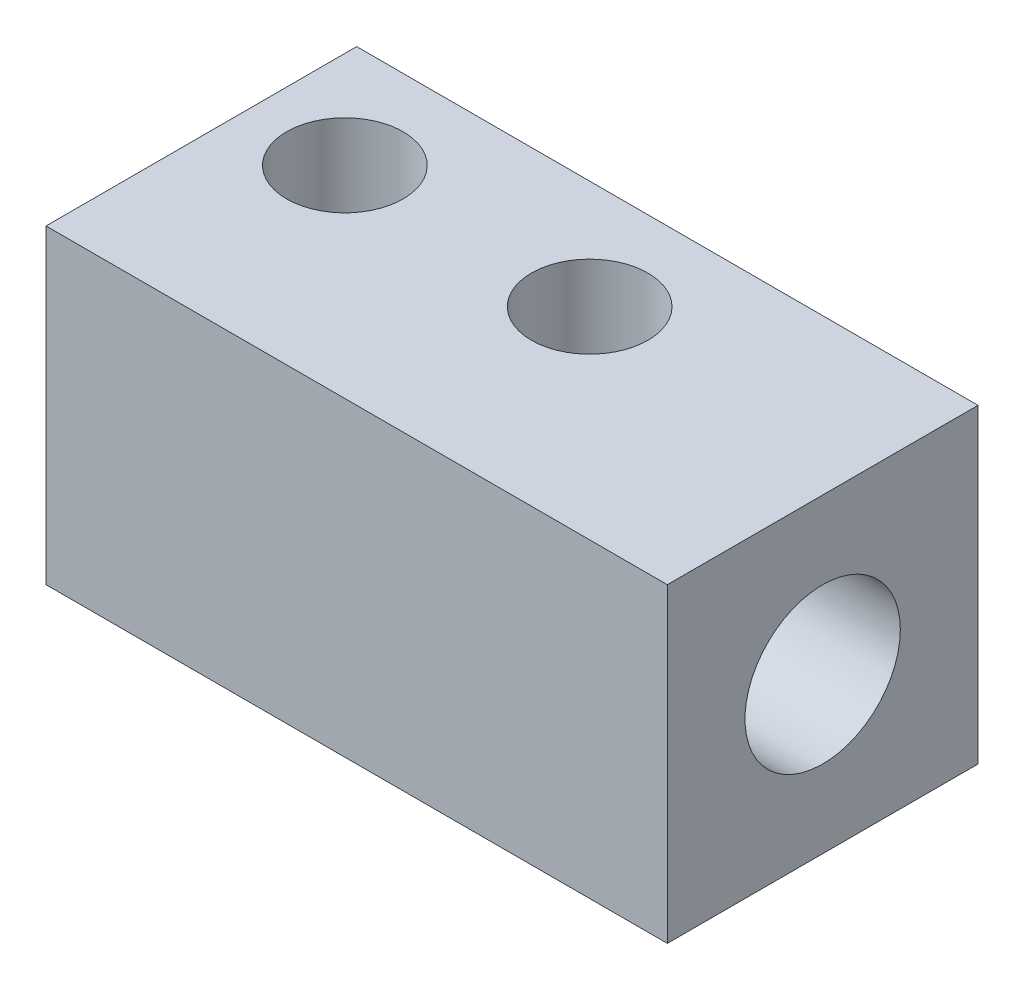
ISO-10303-21;
HEADER;
FILE_DESCRIPTION(('STEP AP214'),'2;1');
FILE_NAME('part.step','',(''),(''),'','','');
FILE_SCHEMA(('AUTOMOTIVE_DESIGN { 1 0 10303 214 1 1 1 1 }'));
ENDSEC;
DATA;
#1=APPLICATION_CONTEXT('core data for automotive mechanical design processes');
#2=APPLICATION_PROTOCOL_DEFINITION('international standard','automotive_design',2000,#1);
#3=PRODUCT_CONTEXT('',#1,'mechanical');
#4=PRODUCT('Part','Part','',(#3));
#5=PRODUCT_RELATED_PRODUCT_CATEGORY('part','',(#4));
#6=PRODUCT_DEFINITION_FORMATION('','',#4);
#7=PRODUCT_DEFINITION_CONTEXT('part definition',#1,'design');
#8=PRODUCT_DEFINITION('design','',#6,#7);
#9=PRODUCT_DEFINITION_SHAPE('','',#8);
#10=(LENGTH_UNIT() NAMED_UNIT(*) SI_UNIT(.MILLI.,.METRE.));
#11=(NAMED_UNIT(*) PLANE_ANGLE_UNIT() SI_UNIT($,.RADIAN.));
#12=(NAMED_UNIT(*) SI_UNIT($,.STERADIAN.) SOLID_ANGLE_UNIT());
#13=UNCERTAINTY_MEASURE_WITH_UNIT(LENGTH_MEASURE(1.E-05),#10,'distance_accuracy_value','');
#14=(GEOMETRIC_REPRESENTATION_CONTEXT(3) GLOBAL_UNCERTAINTY_ASSIGNED_CONTEXT((#13)) GLOBAL_UNIT_ASSIGNED_CONTEXT((#10,
#11,#12)) REPRESENTATION_CONTEXT('',''));
#15=CARTESIAN_POINT('',(0.,0.,0.));
#16=DIRECTION('',(0.,0.,1.));
#17=DIRECTION('',(1.,0.,0.));
#18=AXIS2_PLACEMENT_3D('',#15,#16,#17);
#19=CARTESIAN_POINT('',(0.,0.,6.34999999999999));
#20=DIRECTION('',(1.,0.,0.));
#21=DIRECTION('',(0.,0.,-1.));
#22=AXIS2_PLACEMENT_3D('',#19,#20,#21);
#23=PLANE('',#22);
#24=DIRECTION('',(0.,-1.,0.));
#25=VECTOR('',#24,1.);
#26=CARTESIAN_POINT('',(0.,0.,-6.34999999999999));
#27=LINE('',#26,#25);
#28=CARTESIAN_POINT('',(-1.11022302462516E-13,12.7,-6.34999999999999));
#29=VERTEX_POINT('',#28);
#30=CARTESIAN_POINT('',(0.,0.,-6.34999999999999));
#31=VERTEX_POINT('',#30);
#32=EDGE_CURVE('E105',#29,#31,#27,.T.);
#33=ORIENTED_EDGE('',*,*,#32,.T.);
#34=DIRECTION('',(0.,0.,-1.));
#35=VECTOR('',#34,1.);
#36=CARTESIAN_POINT('',(0.,0.,6.34999999999999));
#37=LINE('',#36,#35);
#38=CARTESIAN_POINT('',(0.,0.,6.34999999999999));
#39=VERTEX_POINT('',#38);
#40=EDGE_CURVE('E11',#39,#31,#37,.T.);
#41=ORIENTED_EDGE('',*,*,#40,.F.);
#42=DIRECTION('',(0.,-1.,0.));
#43=VECTOR('',#42,1.);
#44=CARTESIAN_POINT('',(0.,0.,6.34999999999999));
#45=LINE('',#44,#43);
#46=CARTESIAN_POINT('',(0.,12.7,6.35));
#47=VERTEX_POINT('',#46);
#48=EDGE_CURVE('E93',#47,#39,#45,.T.);
#49=ORIENTED_EDGE('',*,*,#48,.F.);
#50=DIRECTION('',(0.,0.,-1.));
#51=VECTOR('',#50,1.);
#52=CARTESIAN_POINT('',(0.,12.7,6.35));
#53=LINE('',#52,#51);
#54=EDGE_CURVE('E101',#47,#29,#53,.T.);
#55=ORIENTED_EDGE('',*,*,#54,.T.);
#56=EDGE_LOOP('',(#33,#41,#49,#55));
#57=FACE_BOUND('',#56,.T.);
#58=ADVANCED_FACE('F42',(#57),#23,.F.);
#59=CARTESIAN_POINT('',(0.,0.,6.34999999999999));
#60=DIRECTION('',(0.,1.,0.));
#61=DIRECTION('',(0.,0.,1.));
#62=AXIS2_PLACEMENT_3D('',#59,#60,#61);
#63=PLANE('',#62);
#64=CARTESIAN_POINT('',(13.97,0.,-1.905));
#65=DIRECTION('',(0.,1.,0.));
#66=DIRECTION('',(0.,0.,1.));
#67=AXIS2_PLACEMENT_3D('',#64,#65,#66);
#68=CIRCLE('',#67,2.38125);
#69=CARTESIAN_POINT('',(13.97,0.,0.476249999999993));
#70=VERTEX_POINT('',#69);
#71=EDGE_CURVE('E124',#70,#70,#68,.T.);
#72=ORIENTED_EDGE('',*,*,#71,.T.);
#73=EDGE_LOOP('',(#72));
#74=FACE_BOUND('',#73,.T.);
#75=CARTESIAN_POINT('',(3.96240000000001,0.,-1.90500000000003));
#76=DIRECTION('',(0.,1.,0.));
#77=DIRECTION('',(0.,0.,1.));
#78=AXIS2_PLACEMENT_3D('',#75,#76,#77);
#79=CIRCLE('',#78,2.38125);
#80=CARTESIAN_POINT('',(3.96240000000001,0.,0.476249999999964));
#81=VERTEX_POINT('',#80);
#82=EDGE_CURVE('E108',#81,#81,#79,.T.);
#83=ORIENTED_EDGE('',*,*,#82,.T.);
#84=EDGE_LOOP('',(#83));
#85=FACE_BOUND('',#84,.T.);
#86=DIRECTION('',(1.,0.,0.));
#87=VECTOR('',#86,1.);
#88=CARTESIAN_POINT('',(0.,0.,-6.34999999999999));
#89=LINE('',#88,#87);
#90=CARTESIAN_POINT('',(25.4,0.,-6.35000000000002));
#91=VERTEX_POINT('',#90);
#92=EDGE_CURVE('E97',#31,#91,#89,.T.);
#93=ORIENTED_EDGE('',*,*,#92,.T.);
#94=DIRECTION('',(0.,0.,-1.));
#95=VECTOR('',#94,1.);
#96=CARTESIAN_POINT('',(25.4,0.,6.34999999999998));
#97=LINE('',#96,#95);
#98=CARTESIAN_POINT('',(25.4,0.,6.34999999999998));
#99=VERTEX_POINT('',#98);
#100=EDGE_CURVE('E50',#99,#91,#97,.T.);
#101=ORIENTED_EDGE('',*,*,#100,.F.);
#102=DIRECTION('',(1.,0.,0.));
#103=VECTOR('',#102,1.);
#104=CARTESIAN_POINT('',(0.,0.,6.34999999999999));
#105=LINE('',#104,#103);
#106=EDGE_CURVE('E88',#39,#99,#105,.T.);
#107=ORIENTED_EDGE('',*,*,#106,.F.);
#108=ORIENTED_EDGE('',*,*,#40,.T.);
#109=EDGE_LOOP('',(#93,#101,#107,#108));
#110=FACE_BOUND('',#109,.T.);
#111=ADVANCED_FACE('F96',(#74,#85,#110),#63,.F.);
#112=CARTESIAN_POINT('',(25.4,0.,6.34999999999998));
#113=DIRECTION('',(-1.,0.,0.));
#114=DIRECTION('',(0.,0.,1.));
#115=AXIS2_PLACEMENT_3D('',#112,#113,#114);
#116=PLANE('',#115);
#117=CARTESIAN_POINT('',(25.4,6.35000000000003,0.));
#118=DIRECTION('',(1.,0.,0.));
#119=DIRECTION('',(0.,0.,-1.));
#120=AXIS2_PLACEMENT_3D('',#117,#118,#119);
#121=CIRCLE('',#120,3.175);
#122=CARTESIAN_POINT('',(25.4,6.35000000000002,-3.17500000000002));
#123=VERTEX_POINT('',#122);
#124=EDGE_CURVE('E131',#123,#123,#121,.T.);
#125=ORIENTED_EDGE('',*,*,#124,.F.);
#126=EDGE_LOOP('',(#125));
#127=FACE_BOUND('',#126,.T.);
#128=DIRECTION('',(0.,1.,0.));
#129=VECTOR('',#128,1.);
#130=CARTESIAN_POINT('',(25.4,0.,-6.35000000000002));
#131=LINE('',#130,#129);
#132=CARTESIAN_POINT('',(25.4,12.7,-6.34999999999997));
#133=VERTEX_POINT('',#132);
#134=EDGE_CURVE('E75',#91,#133,#131,.T.);
#135=ORIENTED_EDGE('',*,*,#134,.T.);
#136=DIRECTION('',(0.,0.,-1.));
#137=VECTOR('',#136,1.);
#138=CARTESIAN_POINT('',(25.4,12.7,6.35));
#139=LINE('',#138,#137);
#140=CARTESIAN_POINT('',(25.4,12.7,6.35));
#141=VERTEX_POINT('',#140);
#142=EDGE_CURVE('E98',#141,#133,#139,.T.);
#143=ORIENTED_EDGE('',*,*,#142,.F.);
#144=DIRECTION('',(0.,1.,0.));
#145=VECTOR('',#144,1.);
#146=CARTESIAN_POINT('',(25.4,0.,6.34999999999998));
#147=LINE('',#146,#145);
#148=EDGE_CURVE('E91',#99,#141,#147,.T.);
#149=ORIENTED_EDGE('',*,*,#148,.F.);
#150=ORIENTED_EDGE('',*,*,#100,.T.);
#151=EDGE_LOOP('',(#135,#143,#149,#150));
#152=FACE_BOUND('',#151,.T.);
#153=ADVANCED_FACE('F99',(#127,#152),#116,.F.);
#154=CARTESIAN_POINT('',(0.,12.7,6.35));
#155=DIRECTION('',(0.,-1.,0.));
#156=DIRECTION('',(0.,0.,-1.));
#157=AXIS2_PLACEMENT_3D('',#154,#155,#156);
#158=PLANE('',#157);
#159=CARTESIAN_POINT('',(13.97,12.7,-1.90499999999998));
#160=DIRECTION('',(0.,1.,0.));
#161=DIRECTION('',(0.,0.,1.));
#162=AXIS2_PLACEMENT_3D('',#159,#160,#161);
#163=CIRCLE('',#162,2.38125);
#164=CARTESIAN_POINT('',(13.97,12.7,0.476250000000014));
#165=VERTEX_POINT('',#164);
#166=EDGE_CURVE('E127',#165,#165,#163,.T.);
#167=ORIENTED_EDGE('',*,*,#166,.F.);
#168=EDGE_LOOP('',(#167));
#169=FACE_BOUND('',#168,.T.);
#170=CARTESIAN_POINT('',(3.96239999999989,12.7,-1.90500000000001));
#171=DIRECTION('',(0.,1.,0.));
#172=DIRECTION('',(0.,0.,1.));
#173=AXIS2_PLACEMENT_3D('',#170,#171,#172);
#174=CIRCLE('',#173,2.38125);
#175=CARTESIAN_POINT('',(3.96239999999989,12.7,0.476249999999986));
#176=VERTEX_POINT('',#175);
#177=EDGE_CURVE('E121',#176,#176,#174,.T.);
#178=ORIENTED_EDGE('',*,*,#177,.F.);
#179=EDGE_LOOP('',(#178));
#180=FACE_BOUND('',#179,.T.);
#181=DIRECTION('',(-1.,0.,0.));
#182=VECTOR('',#181,1.);
#183=CARTESIAN_POINT('',(-1.11022302462516E-13,12.7,-6.34999999999999));
#184=LINE('',#183,#182);
#185=EDGE_CURVE('E81',#133,#29,#184,.T.);
#186=ORIENTED_EDGE('',*,*,#185,.T.);
#187=ORIENTED_EDGE('',*,*,#54,.F.);
#188=DIRECTION('',(-1.,0.,0.));
#189=VECTOR('',#188,1.);
#190=CARTESIAN_POINT('',(0.,12.7,6.35));
#191=LINE('',#190,#189);
#192=EDGE_CURVE('E58',#141,#47,#191,.T.);
#193=ORIENTED_EDGE('',*,*,#192,.F.);
#194=ORIENTED_EDGE('',*,*,#142,.T.);
#195=EDGE_LOOP('',(#186,#187,#193,#194));
#196=FACE_BOUND('',#195,.T.);
#197=ADVANCED_FACE('F113',(#169,#180,#196),#158,.F.);
#198=CARTESIAN_POINT('',(0.,0.,6.34999999999999));
#199=DIRECTION('',(0.,0.,-1.));
#200=DIRECTION('',(-1.,0.,0.));
#201=AXIS2_PLACEMENT_3D('',#198,#199,#200);
#202=PLANE('',#201);
#203=ORIENTED_EDGE('',*,*,#48,.T.);
#204=ORIENTED_EDGE('',*,*,#106,.T.);
#205=ORIENTED_EDGE('',*,*,#148,.T.);
#206=ORIENTED_EDGE('',*,*,#192,.T.);
#207=EDGE_LOOP('',(#203,#204,#205,#206));
#208=FACE_BOUND('',#207,.T.);
#209=ADVANCED_FACE('F89',(#208),#202,.F.);
#210=CARTESIAN_POINT('',(0.,0.,-6.34999999999999));
#211=DIRECTION('',(0.,0.,-1.));
#212=DIRECTION('',(-1.,0.,0.));
#213=AXIS2_PLACEMENT_3D('',#210,#211,#212);
#214=PLANE('',#213);
#215=ORIENTED_EDGE('',*,*,#32,.F.);
#216=ORIENTED_EDGE('',*,*,#185,.F.);
#217=ORIENTED_EDGE('',*,*,#134,.F.);
#218=ORIENTED_EDGE('',*,*,#92,.F.);
#219=EDGE_LOOP('',(#215,#216,#217,#218));
#220=FACE_BOUND('',#219,.T.);
#221=ADVANCED_FACE('F116',(#220),#214,.T.);
#222=CARTESIAN_POINT('',(3.96239999999989,12.7,-1.90500000000001));
#223=DIRECTION('',(0.,1.,0.));
#224=DIRECTION('',(0.,0.,1.));
#225=AXIS2_PLACEMENT_3D('',#222,#223,#224);
#226=CYLINDRICAL_SURFACE('',#225,2.38125);
#227=ORIENTED_EDGE('',*,*,#82,.F.);
#228=EDGE_LOOP('',(#227));
#229=FACE_BOUND('',#228,.T.);
#230=ORIENTED_EDGE('',*,*,#177,.T.);
#231=EDGE_LOOP('',(#230));
#232=FACE_BOUND('',#231,.T.);
#233=ADVANCED_FACE('F189',(#229,#232),#226,.F.);
#234=CARTESIAN_POINT('',(13.97,12.7,-1.90499999999998));
#235=DIRECTION('',(0.,1.,0.));
#236=DIRECTION('',(0.,0.,1.));
#237=AXIS2_PLACEMENT_3D('',#234,#235,#236);
#238=CYLINDRICAL_SURFACE('',#237,2.38125);
#239=ORIENTED_EDGE('',*,*,#71,.F.);
#240=EDGE_LOOP('',(#239));
#241=FACE_BOUND('',#240,.T.);
#242=ORIENTED_EDGE('',*,*,#166,.T.);
#243=EDGE_LOOP('',(#242));
#244=FACE_BOUND('',#243,.T.);
#245=ADVANCED_FACE('F142',(#241,#244),#238,.F.);
#246=CARTESIAN_POINT('',(19.05,6.34999999999997,0.));
#247=DIRECTION('',(1.,0.,0.));
#248=DIRECTION('',(0.,0.,-1.));
#249=AXIS2_PLACEMENT_3D('',#246,#247,#248);
#250=CYLINDRICAL_SURFACE('',#249,3.175);
#251=CARTESIAN_POINT('',(19.05,6.34999999999997,0.));
#252=DIRECTION('',(1.,0.,0.));
#253=DIRECTION('',(0.,0.,-1.));
#254=AXIS2_PLACEMENT_3D('',#251,#252,#253);
#255=CIRCLE('',#254,3.175);
#256=CARTESIAN_POINT('',(19.05,6.34999999999997,-3.17500000000002));
#257=VERTEX_POINT('',#256);
#258=EDGE_CURVE('E130',#257,#257,#255,.T.);
#259=ORIENTED_EDGE('',*,*,#258,.F.);
#260=EDGE_LOOP('',(#259));
#261=FACE_BOUND('',#260,.T.);
#262=ORIENTED_EDGE('',*,*,#124,.T.);
#263=EDGE_LOOP('',(#262));
#264=FACE_BOUND('',#263,.T.);
#265=ADVANCED_FACE('F139',(#261,#264),#250,.F.);
#266=CARTESIAN_POINT('',(19.05,6.34999999999997,0.));
#267=DIRECTION('',(1.,0.,0.));
#268=DIRECTION('',(0.,0.,-1.));
#269=AXIS2_PLACEMENT_3D('',#266,#267,#268);
#270=PLANE('',#269);
#271=ORIENTED_EDGE('',*,*,#258,.T.);
#272=EDGE_LOOP('',(#271));
#273=FACE_BOUND('',#272,.T.);
#274=ADVANCED_FACE('F137',(#273),#270,.T.);
#275=CLOSED_SHELL('',(#58,#111,#153,#197,#209,#221,#233,#245,#265,#274));
#276=MANIFOLD_SOLID_BREP('B2',#275);
#277=ADVANCED_BREP_SHAPE_REPRESENTATION('',(#18,#276),#14);
#278=SHAPE_DEFINITION_REPRESENTATION(#9,#277);
ENDSEC;
END-ISO-10303-21;
